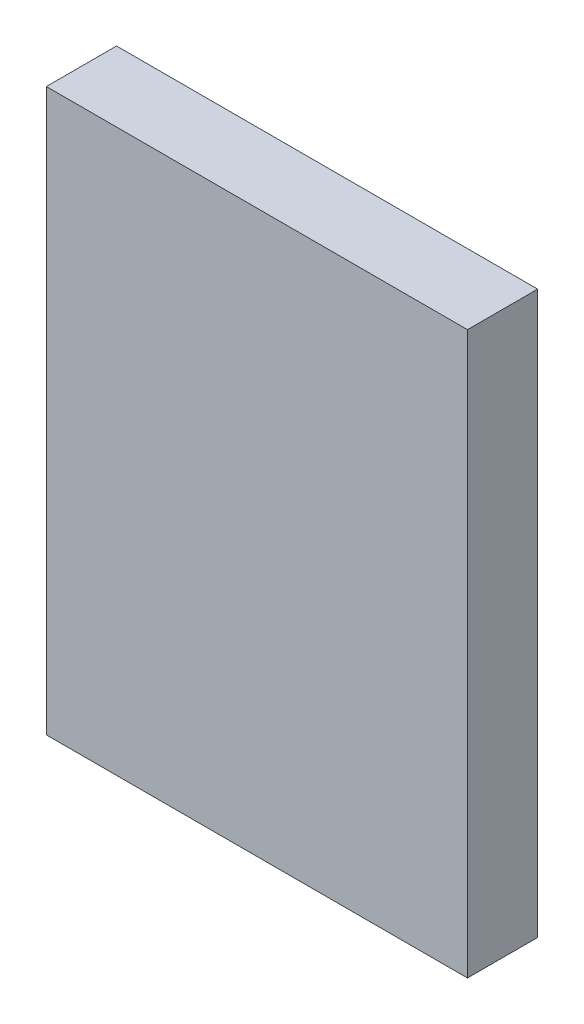
ISO-10303-21;
HEADER;
FILE_DESCRIPTION(('STEP AP214'),'2;1');
FILE_NAME('part.step','',(''),(''),'','','');
FILE_SCHEMA(('AUTOMOTIVE_DESIGN { 1 0 10303 214 1 1 1 1 }'));
ENDSEC;
DATA;
#1=APPLICATION_CONTEXT('core data for automotive mechanical design processes');
#2=APPLICATION_PROTOCOL_DEFINITION('international standard','automotive_design',2000,#1);
#3=PRODUCT_CONTEXT('',#1,'mechanical');
#4=PRODUCT('Part','Part','',(#3));
#5=PRODUCT_RELATED_PRODUCT_CATEGORY('part','',(#4));
#6=PRODUCT_DEFINITION_FORMATION('','',#4);
#7=PRODUCT_DEFINITION_CONTEXT('part definition',#1,'design');
#8=PRODUCT_DEFINITION('design','',#6,#7);
#9=PRODUCT_DEFINITION_SHAPE('','',#8);
#10=(LENGTH_UNIT() NAMED_UNIT(*) SI_UNIT(.MILLI.,.METRE.));
#11=(NAMED_UNIT(*) PLANE_ANGLE_UNIT() SI_UNIT($,.RADIAN.));
#12=(NAMED_UNIT(*) SI_UNIT($,.STERADIAN.) SOLID_ANGLE_UNIT());
#13=UNCERTAINTY_MEASURE_WITH_UNIT(LENGTH_MEASURE(1.E-05),#10,'distance_accuracy_value','');
#14=(GEOMETRIC_REPRESENTATION_CONTEXT(3) GLOBAL_UNCERTAINTY_ASSIGNED_CONTEXT((#13)) GLOBAL_UNIT_ASSIGNED_CONTEXT((#10,
#11,#12)) REPRESENTATION_CONTEXT('',''));
#15=CARTESIAN_POINT('',(0.,0.,0.));
#16=DIRECTION('',(0.,0.,1.));
#17=DIRECTION('',(1.,0.,0.));
#18=AXIS2_PLACEMENT_3D('',#15,#16,#17);
#19=CARTESIAN_POINT('',(15.,20.,5.));
#20=DIRECTION('',(-1.,0.,0.));
#21=DIRECTION('',(0.,-1.,0.));
#22=AXIS2_PLACEMENT_3D('',#19,#20,#21);
#23=PLANE('',#22);
#24=DIRECTION('',(0.,1.,0.));
#25=VECTOR('',#24,1.);
#26=CARTESIAN_POINT('',(15.,20.,0.));
#27=LINE('',#26,#25);
#28=CARTESIAN_POINT('',(15.,-20.,0.));
#29=VERTEX_POINT('',#28);
#30=CARTESIAN_POINT('',(15.,20.,0.));
#31=VERTEX_POINT('',#30);
#32=EDGE_CURVE('E100',#29,#31,#27,.T.);
#33=ORIENTED_EDGE('',*,*,#32,.T.);
#34=DIRECTION('',(0.,0.,-1.));
#35=VECTOR('',#34,1.);
#36=CARTESIAN_POINT('',(15.,20.,5.));
#37=LINE('',#36,#35);
#38=CARTESIAN_POINT('',(15.,20.,5.));
#39=VERTEX_POINT('',#38);
#40=EDGE_CURVE('E11',#39,#31,#37,.T.);
#41=ORIENTED_EDGE('',*,*,#40,.F.);
#42=DIRECTION('',(0.,1.,0.));
#43=VECTOR('',#42,1.);
#44=CARTESIAN_POINT('',(15.,20.,5.));
#45=LINE('',#44,#43);
#46=CARTESIAN_POINT('',(15.,-20.,5.));
#47=VERTEX_POINT('',#46);
#48=EDGE_CURVE('E88',#47,#39,#45,.T.);
#49=ORIENTED_EDGE('',*,*,#48,.F.);
#50=DIRECTION('',(0.,0.,-1.));
#51=VECTOR('',#50,1.);
#52=CARTESIAN_POINT('',(15.,-20.,5.));
#53=LINE('',#52,#51);
#54=EDGE_CURVE('E96',#47,#29,#53,.T.);
#55=ORIENTED_EDGE('',*,*,#54,.T.);
#56=EDGE_LOOP('',(#33,#41,#49,#55));
#57=FACE_BOUND('',#56,.T.);
#58=ADVANCED_FACE('F37',(#57),#23,.F.);
#59=CARTESIAN_POINT('',(-15.,20.,5.));
#60=DIRECTION('',(0.,-1.,0.));
#61=DIRECTION('',(0.,0.,-1.));
#62=AXIS2_PLACEMENT_3D('',#59,#60,#61);
#63=PLANE('',#62);
#64=DIRECTION('',(-1.,0.,0.));
#65=VECTOR('',#64,1.);
#66=CARTESIAN_POINT('',(-15.,20.,0.));
#67=LINE('',#66,#65);
#68=CARTESIAN_POINT('',(-15.,20.,0.));
#69=VERTEX_POINT('',#68);
#70=EDGE_CURVE('E92',#31,#69,#67,.T.);
#71=ORIENTED_EDGE('',*,*,#70,.T.);
#72=DIRECTION('',(0.,0.,-1.));
#73=VECTOR('',#72,1.);
#74=CARTESIAN_POINT('',(-15.,20.,5.));
#75=LINE('',#74,#73);
#76=CARTESIAN_POINT('',(-15.,20.,5.));
#77=VERTEX_POINT('',#76);
#78=EDGE_CURVE('E45',#77,#69,#75,.T.);
#79=ORIENTED_EDGE('',*,*,#78,.F.);
#80=DIRECTION('',(-1.,0.,0.));
#81=VECTOR('',#80,1.);
#82=CARTESIAN_POINT('',(-15.,20.,5.));
#83=LINE('',#82,#81);
#84=EDGE_CURVE('E83',#39,#77,#83,.T.);
#85=ORIENTED_EDGE('',*,*,#84,.F.);
#86=ORIENTED_EDGE('',*,*,#40,.T.);
#87=EDGE_LOOP('',(#71,#79,#85,#86));
#88=FACE_BOUND('',#87,.T.);
#89=ADVANCED_FACE('F91',(#88),#63,.F.);
#90=CARTESIAN_POINT('',(-15.,20.,5.));
#91=DIRECTION('',(1.,0.,0.));
#92=DIRECTION('',(0.,1.,0.));
#93=AXIS2_PLACEMENT_3D('',#90,#91,#92);
#94=PLANE('',#93);
#95=DIRECTION('',(0.,-1.,0.));
#96=VECTOR('',#95,1.);
#97=CARTESIAN_POINT('',(-15.,20.,0.));
#98=LINE('',#97,#96);
#99=CARTESIAN_POINT('',(-15.,-20.,0.));
#100=VERTEX_POINT('',#99);
#101=EDGE_CURVE('E70',#69,#100,#98,.T.);
#102=ORIENTED_EDGE('',*,*,#101,.T.);
#103=DIRECTION('',(0.,0.,-1.));
#104=VECTOR('',#103,1.);
#105=CARTESIAN_POINT('',(-15.,-20.,5.));
#106=LINE('',#105,#104);
#107=CARTESIAN_POINT('',(-15.,-20.,5.));
#108=VERTEX_POINT('',#107);
#109=EDGE_CURVE('E93',#108,#100,#106,.T.);
#110=ORIENTED_EDGE('',*,*,#109,.F.);
#111=DIRECTION('',(0.,-1.,0.));
#112=VECTOR('',#111,1.);
#113=CARTESIAN_POINT('',(-15.,20.,5.));
#114=LINE('',#113,#112);
#115=EDGE_CURVE('E86',#77,#108,#114,.T.);
#116=ORIENTED_EDGE('',*,*,#115,.F.);
#117=ORIENTED_EDGE('',*,*,#78,.T.);
#118=EDGE_LOOP('',(#102,#110,#116,#117));
#119=FACE_BOUND('',#118,.T.);
#120=ADVANCED_FACE('F94',(#119),#94,.F.);
#121=CARTESIAN_POINT('',(-15.,-20.,5.));
#122=DIRECTION('',(0.,1.,0.));
#123=DIRECTION('',(0.,0.,1.));
#124=AXIS2_PLACEMENT_3D('',#121,#122,#123);
#125=PLANE('',#124);
#126=DIRECTION('',(1.,0.,0.));
#127=VECTOR('',#126,1.);
#128=CARTESIAN_POINT('',(-15.,-20.,0.));
#129=LINE('',#128,#127);
#130=EDGE_CURVE('E76',#100,#29,#129,.T.);
#131=ORIENTED_EDGE('',*,*,#130,.T.);
#132=ORIENTED_EDGE('',*,*,#54,.F.);
#133=DIRECTION('',(1.,0.,0.));
#134=VECTOR('',#133,1.);
#135=CARTESIAN_POINT('',(-15.,-20.,5.));
#136=LINE('',#135,#134);
#137=EDGE_CURVE('E53',#108,#47,#136,.T.);
#138=ORIENTED_EDGE('',*,*,#137,.F.);
#139=ORIENTED_EDGE('',*,*,#109,.T.);
#140=EDGE_LOOP('',(#131,#132,#138,#139));
#141=FACE_BOUND('',#140,.T.);
#142=ADVANCED_FACE('F107',(#141),#125,.F.);
#143=CARTESIAN_POINT('',(0.,0.,5.));
#144=DIRECTION('',(0.,0.,1.));
#145=DIRECTION('',(1.,0.,0.));
#146=AXIS2_PLACEMENT_3D('',#143,#144,#145);
#147=PLANE('',#146);
#148=ORIENTED_EDGE('',*,*,#48,.T.);
#149=ORIENTED_EDGE('',*,*,#84,.T.);
#150=ORIENTED_EDGE('',*,*,#115,.T.);
#151=ORIENTED_EDGE('',*,*,#137,.T.);
#152=EDGE_LOOP('',(#148,#149,#150,#151));
#153=FACE_BOUND('',#152,.T.);
#154=ADVANCED_FACE('F84',(#153),#147,.T.);
#155=CARTESIAN_POINT('',(0.,0.,0.));
#156=DIRECTION('',(0.,0.,1.));
#157=DIRECTION('',(1.,0.,0.));
#158=AXIS2_PLACEMENT_3D('',#155,#156,#157);
#159=PLANE('',#158);
#160=ORIENTED_EDGE('',*,*,#32,.F.);
#161=ORIENTED_EDGE('',*,*,#130,.F.);
#162=ORIENTED_EDGE('',*,*,#101,.F.);
#163=ORIENTED_EDGE('',*,*,#70,.F.);
#164=EDGE_LOOP('',(#160,#161,#162,#163));
#165=FACE_BOUND('',#164,.T.);
#166=ADVANCED_FACE('F110',(#165),#159,.F.);
#167=CLOSED_SHELL('',(#58,#89,#120,#142,#154,#166));
#168=MANIFOLD_SOLID_BREP('B2',#167);
#169=ADVANCED_BREP_SHAPE_REPRESENTATION('',(#18,#168),#14);
#170=SHAPE_DEFINITION_REPRESENTATION(#9,#169);
ENDSEC;
END-ISO-10303-21;
